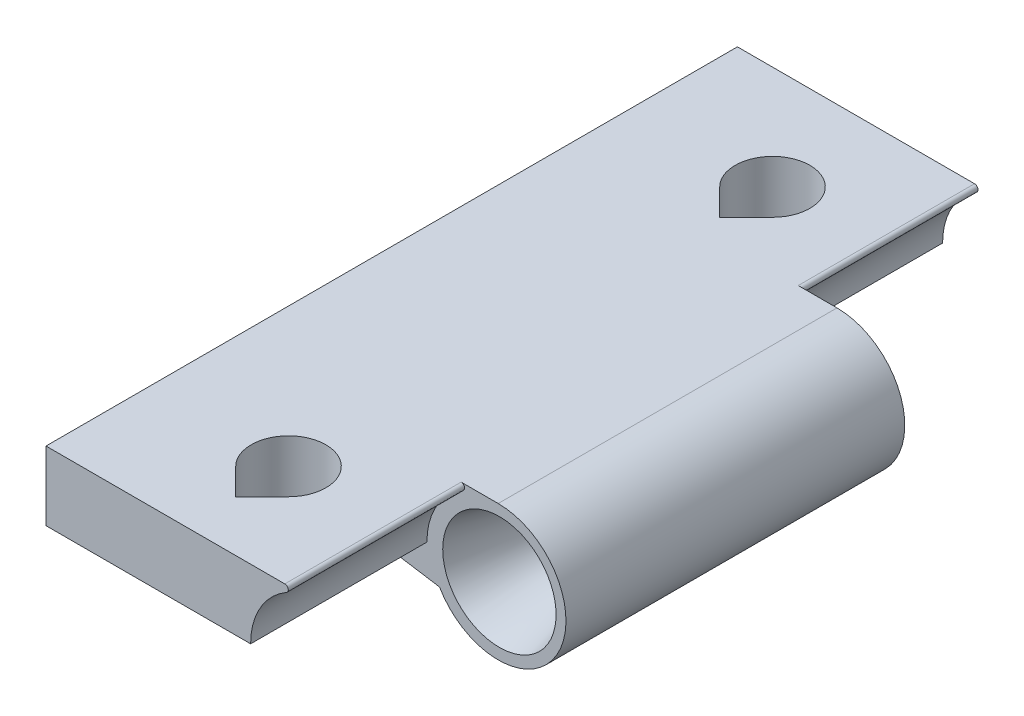
ISO-10303-21;
HEADER;
FILE_DESCRIPTION(('STEP AP214'),'2;1');
FILE_NAME('part.step','',(''),(''),'','','');
FILE_SCHEMA(('AUTOMOTIVE_DESIGN { 1 0 10303 214 1 1 1 1 }'));
ENDSEC;
DATA;
#1=APPLICATION_CONTEXT('core data for automotive mechanical design processes');
#2=APPLICATION_PROTOCOL_DEFINITION('international standard','automotive_design',2000,#1);
#3=PRODUCT_CONTEXT('',#1,'mechanical');
#4=PRODUCT('Part','Part','',(#3));
#5=PRODUCT_RELATED_PRODUCT_CATEGORY('part','',(#4));
#6=PRODUCT_DEFINITION_FORMATION('','',#4);
#7=PRODUCT_DEFINITION_CONTEXT('part definition',#1,'design');
#8=PRODUCT_DEFINITION('design','',#6,#7);
#9=PRODUCT_DEFINITION_SHAPE('','',#8);
#10=(LENGTH_UNIT() NAMED_UNIT(*) SI_UNIT(.MILLI.,.METRE.));
#11=(NAMED_UNIT(*) PLANE_ANGLE_UNIT() SI_UNIT($,.RADIAN.));
#12=(NAMED_UNIT(*) SI_UNIT($,.STERADIAN.) SOLID_ANGLE_UNIT());
#13=UNCERTAINTY_MEASURE_WITH_UNIT(LENGTH_MEASURE(1.E-05),#10,'distance_accuracy_value','');
#14=(GEOMETRIC_REPRESENTATION_CONTEXT(3) GLOBAL_UNCERTAINTY_ASSIGNED_CONTEXT((#13)) GLOBAL_UNIT_ASSIGNED_CONTEXT((#10,
#11,#12)) REPRESENTATION_CONTEXT('',''));
#15=CARTESIAN_POINT('',(0.,0.,0.));
#16=DIRECTION('',(0.,0.,1.));
#17=DIRECTION('',(1.,0.,0.));
#18=AXIS2_PLACEMENT_3D('',#15,#16,#17);
#19=CARTESIAN_POINT('',(-0.086602540378445,-0.0286580778791866,12.25));
#20=DIRECTION('',(0.,0.,-1.));
#21=DIRECTION('',(-1.,0.,0.));
#22=AXIS2_PLACEMENT_3D('',#19,#20,#21);
#23=PLANE('',#22);
#24=CARTESIAN_POINT('',(0.,0.,12.25));
#25=DIRECTION('',(0.,0.,-1.));
#26=DIRECTION('',(-1.,0.,0.));
#27=AXIS2_PLACEMENT_3D('',#24,#25,#26);
#28=CIRCLE('',#27,4.1);
#29=CARTESIAN_POINT('',(-4.1,0.,12.25));
#30=VERTEX_POINT('',#29);
#31=EDGE_CURVE('E527',#30,#30,#28,.T.);
#32=ORIENTED_EDGE('',*,*,#31,.T.);
#33=EDGE_LOOP('',(#32));
#34=FACE_BOUND('',#33,.T.);
#35=CARTESIAN_POINT('',(-2.76759308368012,4.62134192212082,12.25));
#36=DIRECTION('',(0.,0.,1.));
#37=DIRECTION('',(-1.,0.,0.));
#38=AXIS2_PLACEMENT_3D('',#35,#36,#37);
#39=CIRCLE('',#38,0.249999999999998);
#40=CARTESIAN_POINT('',(-2.64156425473294,4.40543283413654,12.25));
#41=VERTEX_POINT('',#40);
#42=CARTESIAN_POINT('',(-2.76759308368012,4.87134192212081,12.25));
#43=VERTEX_POINT('',#42);
#44=EDGE_CURVE('E205',#41,#43,#39,.T.);
#45=ORIENTED_EDGE('',*,*,#44,.F.);
#46=CARTESIAN_POINT('',(0.,-0.1200216500139,12.25));
#47=DIRECTION('',(0.,0.,-1.));
#48=DIRECTION('',(1.,0.,0.));
#49=AXIS2_PLACEMENT_3D('',#46,#47,#48);
#50=CIRCLE('',#49,5.24);
#51=CARTESIAN_POINT('',(-5.24000000000003,-0.1200216500139,12.25));
#52=VERTEX_POINT('',#51);
#53=EDGE_CURVE('E240',#52,#41,#50,.T.);
#54=ORIENTED_EDGE('',*,*,#53,.F.);
#55=DIRECTION('',(1.,0.,0.));
#56=VECTOR('',#55,1.);
#57=CARTESIAN_POINT('',(-5.24000000000002,-0.120021650013901,12.25));
#58=LINE('',#57,#56);
#59=CARTESIAN_POINT('',(-19.1498814521335,-0.120021650013903,12.25));
#60=VERTEX_POINT('',#59);
#61=EDGE_CURVE('E284',#60,#52,#58,.T.);
#62=ORIENTED_EDGE('',*,*,#61,.F.);
#63=DIRECTION('',(0.987570499863666,-0.157176677019933,0.));
#64=VECTOR('',#63,1.);
#65=CARTESIAN_POINT('',(-4.3301270189222,-2.47865807787918,12.25));
#66=LINE('',#65,#64);
#67=CARTESIAN_POINT('',(-4.3301270189222,-2.47865807787919,12.25));
#68=VERTEX_POINT('',#67);
#69=EDGE_CURVE('E224',#60,#68,#66,.T.);
#70=ORIENTED_EDGE('',*,*,#69,.T.);
#71=CARTESIAN_POINT('',(-0.086602540378445,-0.0286580778791866,12.25));
#72=DIRECTION('',(0.,0.,1.));
#73=DIRECTION('',(-1.,0.,0.));
#74=AXIS2_PLACEMENT_3D('',#71,#72,#73);
#75=CIRCLE('',#74,4.9);
#76=CARTESIAN_POINT('',(-0.086602540378445,4.87134192212081,12.25));
#77=VERTEX_POINT('',#76);
#78=EDGE_CURVE('E229',#68,#77,#75,.T.);
#79=ORIENTED_EDGE('',*,*,#78,.T.);
#80=DIRECTION('',(-1.,0.,0.));
#81=VECTOR('',#80,1.);
#82=CARTESIAN_POINT('',(-20.0380952523138,4.87134192212081,12.25));
#83=LINE('',#82,#81);
#84=EDGE_CURVE('E235',#77,#43,#83,.T.);
#85=ORIENTED_EDGE('',*,*,#84,.T.);
#86=EDGE_LOOP('',(#45,#54,#62,#70,#79,#85));
#87=FACE_BOUND('',#86,.T.);
#88=ADVANCED_FACE('F33',(#34,#87),#23,.F.);
#89=CARTESIAN_POINT('',(-2.89055194062657,4.62086573519927,-12.25));
#90=DIRECTION('',(0.,0.,-1.));
#91=DIRECTION('',(-1.,0.,0.));
#92=AXIS2_PLACEMENT_3D('',#89,#90,#91);
#93=PLANE('',#92);
#94=DIRECTION('',(0.987570499863666,-0.157176677019933,0.));
#95=VECTOR('',#94,1.);
#96=CARTESIAN_POINT('',(-4.3301270189222,-2.47865807787918,-12.25));
#97=LINE('',#96,#95);
#98=CARTESIAN_POINT('',(-20.0380952523139,0.0213419221208145,-12.25));
#99=VERTEX_POINT('',#98);
#100=CARTESIAN_POINT('',(-19.9039999584285,0.,-12.25));
#101=VERTEX_POINT('',#100);
#102=EDGE_CURVE('E257',#99,#101,#97,.T.);
#103=ORIENTED_EDGE('',*,*,#102,.F.);
#104=DIRECTION('',(0.,1.,0.));
#105=VECTOR('',#104,1.);
#106=CARTESIAN_POINT('',(-20.0380952523139,0.,-12.25));
#107=LINE('',#106,#105);
#108=CARTESIAN_POINT('',(-20.0380952523139,0.,-12.25));
#109=VERTEX_POINT('',#108);
#110=EDGE_CURVE('E272',#109,#99,#107,.T.);
#111=ORIENTED_EDGE('',*,*,#110,.F.);
#112=DIRECTION('',(-1.,0.,0.));
#113=VECTOR('',#112,1.);
#114=CARTESIAN_POINT('',(-5.2,0.,-12.25));
#115=LINE('',#114,#113);
#116=EDGE_CURVE('E298',#101,#109,#115,.T.);
#117=ORIENTED_EDGE('',*,*,#116,.F.);
#118=EDGE_LOOP('',(#103,#111,#117));
#119=FACE_BOUND('',#118,.T.);
#120=ADVANCED_FACE('F368',(#119),#93,.F.);
#121=CARTESIAN_POINT('',(-2.89055194062657,4.62086573519927,-12.25));
#122=DIRECTION('',(0.,0.,-1.));
#123=DIRECTION('',(-1.,0.,0.));
#124=AXIS2_PLACEMENT_3D('',#121,#122,#123);
#125=CYLINDRICAL_SURFACE('',#124,0.250476186921538);
#126=CARTESIAN_POINT('',(-2.89055194062656,4.62086573519927,-25.));
#127=DIRECTION('',(0.,0.,-1.));
#128=DIRECTION('',(-1.,0.,0.));
#129=AXIS2_PLACEMENT_3D('',#126,#127,#128);
#130=CIRCLE('',#129,0.250476186921538);
#131=CARTESIAN_POINT('',(-2.89055194062656,4.87134192212081,-25.));
#132=VERTEX_POINT('',#131);
#133=CARTESIAN_POINT('',(-2.75771686285407,4.40851422866369,-25.));
#134=VERTEX_POINT('',#133);
#135=EDGE_CURVE('E278',#132,#134,#130,.T.);
#136=ORIENTED_EDGE('',*,*,#135,.F.);
#137=DIRECTION('',(0.,0.,-1.));
#138=VECTOR('',#137,1.);
#139=CARTESIAN_POINT('',(-2.89055194062657,4.87134192212081,-12.25));
#140=LINE('',#139,#138);
#141=CARTESIAN_POINT('',(-2.89055194062657,4.87134192212081,-12.25));
#142=VERTEX_POINT('',#141);
#143=EDGE_CURVE('E282',#142,#132,#140,.T.);
#144=ORIENTED_EDGE('',*,*,#143,.F.);
#145=CARTESIAN_POINT('',(-2.89055194062657,4.62086573519927,-12.25));
#146=DIRECTION('',(0.,0.,-1.));
#147=DIRECTION('',(-1.,0.,0.));
#148=AXIS2_PLACEMENT_3D('',#145,#146,#147);
#149=CIRCLE('',#148,0.250476186921538);
#150=CARTESIAN_POINT('',(-2.75771686285408,4.40851422866369,-12.25));
#151=VERTEX_POINT('',#150);
#152=EDGE_CURVE('E287',#142,#151,#149,.T.);
#153=ORIENTED_EDGE('',*,*,#152,.T.);
#154=DIRECTION('',(0.,0.,-1.));
#155=VECTOR('',#154,1.);
#156=CARTESIAN_POINT('',(-2.75771686285408,4.40851422866369,-12.25));
#157=LINE('',#156,#155);
#158=EDGE_CURVE('E319',#151,#134,#157,.T.);
#159=ORIENTED_EDGE('',*,*,#158,.T.);
#160=EDGE_LOOP('',(#136,#144,#153,#159));
#161=FACE_BOUND('',#160,.T.);
#162=ADVANCED_FACE('F35',(#161),#125,.T.);
#163=CARTESIAN_POINT('',(-20.0380952523139,4.87134192212081,-12.25));
#164=DIRECTION('',(0.,1.,0.));
#165=DIRECTION('',(-1.,0.,0.));
#166=AXIS2_PLACEMENT_3D('',#163,#164,#165);
#167=PLANE('',#166);
#168=DIRECTION('',(0.707106781186543,0.,0.707106781186552));
#169=VECTOR('',#168,1.);
#170=CARTESIAN_POINT('',(-11.9091883092037,4.87134192212081,19.4091883092037));
#171=LINE('',#170,#169);
#172=CARTESIAN_POINT('',(-11.9091883092037,4.87134192212081,19.4091883092037));
#173=VERTEX_POINT('',#172);
#174=CARTESIAN_POINT('',(-10.,4.87134192212081,21.3183766184074));
#175=VERTEX_POINT('',#174);
#176=EDGE_CURVE('E48',#173,#175,#171,.T.);
#177=ORIENTED_EDGE('',*,*,#176,.F.);
#178=CARTESIAN_POINT('',(-10.,4.87134192212081,17.5));
#179=DIRECTION('',(0.,1.,0.));
#180=DIRECTION('',(0.,0.,1.));
#181=AXIS2_PLACEMENT_3D('',#178,#179,#180);
#182=CIRCLE('',#181,2.70000000000001);
#183=CARTESIAN_POINT('',(-8.09081169079631,4.87134192212081,19.4091883092037));
#184=VERTEX_POINT('',#183);
#185=EDGE_CURVE('E167',#184,#173,#182,.T.);
#186=ORIENTED_EDGE('',*,*,#185,.F.);
#187=DIRECTION('',(0.707106781186543,0.,-0.707106781186552));
#188=VECTOR('',#187,1.);
#189=CARTESIAN_POINT('',(-10.,4.87134192212081,21.3183766184074));
#190=LINE('',#189,#188);
#191=EDGE_CURVE('E174',#175,#184,#190,.T.);
#192=ORIENTED_EDGE('',*,*,#191,.F.);
#193=EDGE_LOOP('',(#177,#186,#192));
#194=FACE_BOUND('',#193,.T.);
#195=DIRECTION('',(0.707106781186544,0.,0.707106781186551));
#196=VECTOR('',#195,1.);
#197=CARTESIAN_POINT('',(-11.9091883092037,4.87134192212081,-15.5908116907963));
#198=LINE('',#197,#196);
#199=CARTESIAN_POINT('',(-11.9091883092037,4.87134192212081,-15.5908116907963));
#200=VERTEX_POINT('',#199);
#201=CARTESIAN_POINT('',(-10.,4.87134192212081,-13.6816233815926));
#202=VERTEX_POINT('',#201);
#203=EDGE_CURVE('E184',#200,#202,#198,.T.);
#204=ORIENTED_EDGE('',*,*,#203,.F.);
#205=CARTESIAN_POINT('',(-10.,4.87134192212081,-17.5));
#206=DIRECTION('',(0.,1.,0.));
#207=DIRECTION('',(0.,0.,1.));
#208=AXIS2_PLACEMENT_3D('',#205,#206,#207);
#209=CIRCLE('',#208,2.70000000000002);
#210=CARTESIAN_POINT('',(-8.09081169079631,4.87134192212081,-15.5908116907963));
#211=VERTEX_POINT('',#210);
#212=EDGE_CURVE('E190',#211,#200,#209,.T.);
#213=ORIENTED_EDGE('',*,*,#212,.F.);
#214=DIRECTION('',(0.707106781186543,0.,-0.707106781186552));
#215=VECTOR('',#214,1.);
#216=CARTESIAN_POINT('',(-10.,4.87134192212081,-13.6816233815926));
#217=LINE('',#216,#215);
#218=EDGE_CURVE('E187',#202,#211,#217,.T.);
#219=ORIENTED_EDGE('',*,*,#218,.F.);
#220=EDGE_LOOP('',(#204,#213,#219));
#221=FACE_BOUND('',#220,.T.);
#222=DIRECTION('',(1.,0.,0.));
#223=VECTOR('',#222,1.);
#224=CARTESIAN_POINT('',(-20.0380952523138,4.87134192212081,-25.));
#225=LINE('',#224,#223);
#226=CARTESIAN_POINT('',(-20.0380952523138,4.87134192212081,-25.));
#227=VERTEX_POINT('',#226);
#228=EDGE_CURVE('E291',#227,#132,#225,.T.);
#229=ORIENTED_EDGE('',*,*,#228,.F.);
#230=DIRECTION('',(0.,0.,-1.));
#231=VECTOR('',#230,1.);
#232=CARTESIAN_POINT('',(-20.0380952523139,4.87134192212081,-12.25));
#233=LINE('',#232,#231);
#234=CARTESIAN_POINT('',(-20.0380952523138,4.87134192212081,25.));
#235=VERTEX_POINT('',#234);
#236=EDGE_CURVE('E285',#235,#227,#233,.T.);
#237=ORIENTED_EDGE('',*,*,#236,.F.);
#238=DIRECTION('',(-1.,0.,0.));
#239=VECTOR('',#238,1.);
#240=CARTESIAN_POINT('',(-20.0380952523138,4.87134192212081,25.));
#241=LINE('',#240,#239);
#242=CARTESIAN_POINT('',(-2.76759308368012,4.87134192212081,25.));
#243=VERTEX_POINT('',#242);
#244=EDGE_CURVE('E211',#243,#235,#241,.T.);
#245=ORIENTED_EDGE('',*,*,#244,.F.);
#246=DIRECTION('',(0.,0.,-1.));
#247=VECTOR('',#246,1.);
#248=CARTESIAN_POINT('',(-2.76759308368012,4.87134192212081,25.));
#249=LINE('',#248,#247);
#250=EDGE_CURVE('E214',#243,#43,#249,.T.);
#251=ORIENTED_EDGE('',*,*,#250,.T.);
#252=ORIENTED_EDGE('',*,*,#84,.F.);
#253=DIRECTION('',(0.,0.,-1.));
#254=VECTOR('',#253,1.);
#255=CARTESIAN_POINT('',(-0.086602540378445,4.87134192212081,12.25));
#256=LINE('',#255,#254);
#257=CARTESIAN_POINT('',(-0.086602540378445,4.87134192212081,-12.25));
#258=VERTEX_POINT('',#257);
#259=EDGE_CURVE('E419',#77,#258,#256,.T.);
#260=ORIENTED_EDGE('',*,*,#259,.T.);
#261=DIRECTION('',(-1.,0.,0.));
#262=VECTOR('',#261,1.);
#263=CARTESIAN_POINT('',(-20.0380952523138,4.87134192212081,-12.25));
#264=LINE('',#263,#262);
#265=EDGE_CURVE('E228',#258,#142,#264,.T.);
#266=ORIENTED_EDGE('',*,*,#265,.T.);
#267=ORIENTED_EDGE('',*,*,#143,.T.);
#268=EDGE_LOOP('',(#229,#237,#245,#251,#252,#260,#266,#267));
#269=FACE_BOUND('',#268,.T.);
#270=ADVANCED_FACE('F178',(#194,#221,#269),#167,.T.);
#271=CARTESIAN_POINT('',(-20.0380952523139,0.,-12.25));
#272=DIRECTION('',(-1.,0.,0.));
#273=DIRECTION('',(0.,0.,1.));
#274=AXIS2_PLACEMENT_3D('',#271,#272,#273);
#275=PLANE('',#274);
#276=DIRECTION('',(0.,1.,0.));
#277=VECTOR('',#276,1.);
#278=CARTESIAN_POINT('',(-20.0380952523138,0.,-25.));
#279=LINE('',#278,#277);
#280=CARTESIAN_POINT('',(-20.0380952523138,0.,-25.));
#281=VERTEX_POINT('',#280);
#282=EDGE_CURVE('E310',#281,#227,#279,.T.);
#283=ORIENTED_EDGE('',*,*,#282,.F.);
#284=DIRECTION('',(0.,0.,-1.));
#285=VECTOR('',#284,1.);
#286=CARTESIAN_POINT('',(-20.0380952523139,0.,-12.25));
#287=LINE('',#286,#285);
#288=EDGE_CURVE('E316',#109,#281,#287,.T.);
#289=ORIENTED_EDGE('',*,*,#288,.F.);
#290=ORIENTED_EDGE('',*,*,#110,.T.);
#291=DIRECTION('',(0.,0.,-1.));
#292=VECTOR('',#291,1.);
#293=CARTESIAN_POINT('',(-20.0380952523138,0.0213419221208131,12.25));
#294=LINE('',#293,#292);
#295=CARTESIAN_POINT('',(-20.0380952523138,0.0213419221208131,12.25));
#296=VERTEX_POINT('',#295);
#297=EDGE_CURVE('E275',#296,#99,#294,.T.);
#298=ORIENTED_EDGE('',*,*,#297,.F.);
#299=DIRECTION('',(0.,-1.,0.));
#300=VECTOR('',#299,1.);
#301=CARTESIAN_POINT('',(-20.0380952523138,-0.120021650013904,12.25));
#302=LINE('',#301,#300);
#303=CARTESIAN_POINT('',(-20.0380952523138,-0.120021650013904,12.25));
#304=VERTEX_POINT('',#303);
#305=EDGE_CURVE('E196',#296,#304,#302,.T.);
#306=ORIENTED_EDGE('',*,*,#305,.T.);
#307=DIRECTION('',(0.,0.,-1.));
#308=VECTOR('',#307,1.);
#309=CARTESIAN_POINT('',(-20.0380952523138,-0.120021650013904,25.));
#310=LINE('',#309,#308);
#311=CARTESIAN_POINT('',(-20.0380952523138,-0.120021650013904,25.));
#312=VERTEX_POINT('',#311);
#313=EDGE_CURVE('E222',#312,#304,#310,.T.);
#314=ORIENTED_EDGE('',*,*,#313,.F.);
#315=DIRECTION('',(0.,-1.,0.));
#316=VECTOR('',#315,1.);
#317=CARTESIAN_POINT('',(-20.0380952523138,-0.120021650013904,25.));
#318=LINE('',#317,#316);
#319=EDGE_CURVE('E201',#235,#312,#318,.T.);
#320=ORIENTED_EDGE('',*,*,#319,.F.);
#321=ORIENTED_EDGE('',*,*,#236,.T.);
#322=EDGE_LOOP('',(#283,#289,#290,#298,#306,#314,#320,#321));
#323=FACE_BOUND('',#322,.T.);
#324=ADVANCED_FACE('F329',(#323),#275,.T.);
#325=CARTESIAN_POINT('',(-5.2,0.,-12.25));
#326=DIRECTION('',(0.,-1.,0.));
#327=DIRECTION('',(0.,0.,-1.));
#328=AXIS2_PLACEMENT_3D('',#325,#326,#327);
#329=PLANE('',#328);
#330=DIRECTION('',(-0.707106781186544,0.,-0.707106781186551));
#331=VECTOR('',#330,1.);
#332=CARTESIAN_POINT('',(-6.88418830920372,0.,-10.5658116907963));
#333=LINE('',#332,#331);
#334=CARTESIAN_POINT('',(-10.,0.,-13.6816233815926));
#335=VERTEX_POINT('',#334);
#336=CARTESIAN_POINT('',(-11.9091883092037,0.,-15.5908116907963));
#337=VERTEX_POINT('',#336);
#338=EDGE_CURVE('E347',#335,#337,#333,.T.);
#339=ORIENTED_EDGE('',*,*,#338,.F.);
#340=DIRECTION('',(-0.707106781186543,0.,0.707106781186552));
#341=VECTOR('',#340,1.);
#342=CARTESIAN_POINT('',(-8.31581169079633,0.,-15.3658116907963));
#343=LINE('',#342,#341);
#344=CARTESIAN_POINT('',(-8.09081169079631,0.,-15.5908116907963));
#345=VERTEX_POINT('',#344);
#346=EDGE_CURVE('E340',#345,#335,#343,.T.);
#347=ORIENTED_EDGE('',*,*,#346,.F.);
#348=CARTESIAN_POINT('',(-10.,0.,-17.5));
#349=DIRECTION('',(0.,-1.,0.));
#350=DIRECTION('',(0.,0.,-1.));
#351=AXIS2_PLACEMENT_3D('',#348,#349,#350);
#352=CIRCLE('',#351,2.70000000000002);
#353=EDGE_CURVE('E341',#337,#345,#352,.T.);
#354=ORIENTED_EDGE('',*,*,#353,.F.);
#355=EDGE_LOOP('',(#339,#347,#354));
#356=FACE_BOUND('',#355,.T.);
#357=DIRECTION('',(-1.,0.,0.));
#358=VECTOR('',#357,1.);
#359=CARTESIAN_POINT('',(-5.19999999999999,0.,-25.));
#360=LINE('',#359,#358);
#361=CARTESIAN_POINT('',(-5.19999999999999,0.,-25.));
#362=VERTEX_POINT('',#361);
#363=EDGE_CURVE('E307',#362,#281,#360,.T.);
#364=ORIENTED_EDGE('',*,*,#363,.F.);
#365=DIRECTION('',(0.,0.,-1.));
#366=VECTOR('',#365,1.);
#367=CARTESIAN_POINT('',(-5.2,0.,-12.25));
#368=LINE('',#367,#366);
#369=CARTESIAN_POINT('',(-5.2,0.,-12.25));
#370=VERTEX_POINT('',#369);
#371=EDGE_CURVE('E318',#370,#362,#368,.T.);
#372=ORIENTED_EDGE('',*,*,#371,.F.);
#373=EDGE_CURVE('E299',#370,#101,#115,.T.);
#374=ORIENTED_EDGE('',*,*,#373,.T.);
#375=ORIENTED_EDGE('',*,*,#116,.T.);
#376=ORIENTED_EDGE('',*,*,#288,.T.);
#377=EDGE_LOOP('',(#364,#372,#374,#375,#376));
#378=FACE_BOUND('',#377,.T.);
#379=ADVANCED_FACE('F399',(#356,#378),#329,.T.);
#380=CARTESIAN_POINT('',(0.,0.,-12.25));
#381=DIRECTION('',(0.,0.,-1.));
#382=DIRECTION('',(-1.,0.,0.));
#383=AXIS2_PLACEMENT_3D('',#380,#381,#382);
#384=CYLINDRICAL_SURFACE('',#383,5.2);
#385=CARTESIAN_POINT('',(0.,0.,-25.));
#386=DIRECTION('',(0.,0.,1.));
#387=DIRECTION('',(1.,0.,0.));
#388=AXIS2_PLACEMENT_3D('',#385,#386,#387);
#389=CIRCLE('',#388,5.2);
#390=EDGE_CURVE('E304',#134,#362,#389,.T.);
#391=ORIENTED_EDGE('',*,*,#390,.F.);
#392=ORIENTED_EDGE('',*,*,#158,.F.);
#393=CARTESIAN_POINT('',(0.,0.,-12.25));
#394=DIRECTION('',(0.,0.,1.));
#395=DIRECTION('',(1.,0.,0.));
#396=AXIS2_PLACEMENT_3D('',#393,#394,#395);
#397=CIRCLE('',#396,5.2);
#398=EDGE_CURVE('E290',#151,#370,#397,.T.);
#399=ORIENTED_EDGE('',*,*,#398,.T.);
#400=ORIENTED_EDGE('',*,*,#371,.T.);
#401=EDGE_LOOP('',(#391,#392,#399,#400));
#402=FACE_BOUND('',#401,.T.);
#403=ADVANCED_FACE('F393',(#402),#384,.F.);
#404=CARTESIAN_POINT('',(-2.89055194062656,4.62086573519927,-25.));
#405=DIRECTION('',(0.,0.,-1.));
#406=DIRECTION('',(-1.,0.,0.));
#407=AXIS2_PLACEMENT_3D('',#404,#405,#406);
#408=PLANE('',#407);
#409=ORIENTED_EDGE('',*,*,#135,.T.);
#410=ORIENTED_EDGE('',*,*,#390,.T.);
#411=ORIENTED_EDGE('',*,*,#363,.T.);
#412=ORIENTED_EDGE('',*,*,#282,.T.);
#413=ORIENTED_EDGE('',*,*,#228,.T.);
#414=EDGE_LOOP('',(#409,#410,#411,#412,#413));
#415=FACE_BOUND('',#414,.T.);
#416=ADVANCED_FACE('F383',(#415),#408,.T.);
#417=CARTESIAN_POINT('',(-0.086602540378445,-0.0286580778791866,-12.25));
#418=DIRECTION('',(0.,0.,-1.));
#419=DIRECTION('',(-1.,0.,0.));
#420=AXIS2_PLACEMENT_3D('',#417,#418,#419);
#421=PLANE('',#420);
#422=CARTESIAN_POINT('',(0.,0.,-12.25));
#423=DIRECTION('',(0.,0.,-1.));
#424=DIRECTION('',(-1.,0.,0.));
#425=AXIS2_PLACEMENT_3D('',#422,#423,#424);
#426=CIRCLE('',#425,4.18291636243239);
#427=CARTESIAN_POINT('',(-4.18291636243239,0.,-12.25));
#428=VERTEX_POINT('',#427);
#429=EDGE_CURVE('E530',#428,#428,#426,.T.);
#430=ORIENTED_EDGE('',*,*,#429,.F.);
#431=EDGE_LOOP('',(#430));
#432=FACE_BOUND('',#431,.T.);
#433=ORIENTED_EDGE('',*,*,#152,.F.);
#434=ORIENTED_EDGE('',*,*,#265,.F.);
#435=CARTESIAN_POINT('',(-0.086602540378445,-0.0286580778791866,-12.25));
#436=DIRECTION('',(0.,0.,1.));
#437=DIRECTION('',(-1.,0.,0.));
#438=AXIS2_PLACEMENT_3D('',#435,#436,#437);
#439=CIRCLE('',#438,4.9);
#440=CARTESIAN_POINT('',(-4.3301270189222,-2.47865807787919,-12.25));
#441=VERTEX_POINT('',#440);
#442=EDGE_CURVE('E264',#441,#258,#439,.T.);
#443=ORIENTED_EDGE('',*,*,#442,.F.);
#444=EDGE_CURVE('E253',#101,#441,#97,.T.);
#445=ORIENTED_EDGE('',*,*,#444,.F.);
#446=ORIENTED_EDGE('',*,*,#373,.F.);
#447=ORIENTED_EDGE('',*,*,#398,.F.);
#448=EDGE_LOOP('',(#433,#434,#443,#445,#446,#447));
#449=FACE_BOUND('',#448,.T.);
#450=ADVANCED_FACE('F380',(#432,#449),#421,.T.);
#451=CARTESIAN_POINT('',(-4.3301270189222,-2.47865807787918,12.25));
#452=DIRECTION('',(0.157176677019933,0.987570499863666,0.));
#453=DIRECTION('',(-0.987570499863667,0.157176677019933,0.));
#454=AXIS2_PLACEMENT_3D('',#451,#452,#453);
#455=PLANE('',#454);
#456=ORIENTED_EDGE('',*,*,#102,.T.);
#457=ORIENTED_EDGE('',*,*,#444,.T.);
#458=DIRECTION('',(0.,0.,-1.));
#459=VECTOR('',#458,1.);
#460=CARTESIAN_POINT('',(-4.3301270189222,-2.47865807787919,12.25));
#461=LINE('',#460,#459);
#462=EDGE_CURVE('E279',#68,#441,#461,.T.);
#463=ORIENTED_EDGE('',*,*,#462,.F.);
#464=ORIENTED_EDGE('',*,*,#69,.F.);
#465=EDGE_CURVE('E227',#296,#60,#66,.T.);
#466=ORIENTED_EDGE('',*,*,#465,.F.);
#467=ORIENTED_EDGE('',*,*,#297,.T.);
#468=EDGE_LOOP('',(#456,#457,#463,#464,#466,#467));
#469=FACE_BOUND('',#468,.T.);
#470=ADVANCED_FACE('F333',(#469),#455,.F.);
#471=CARTESIAN_POINT('',(-0.086602540378445,-0.0286580778791866,12.25));
#472=DIRECTION('',(0.,0.,-1.));
#473=DIRECTION('',(-1.,0.,0.));
#474=AXIS2_PLACEMENT_3D('',#471,#472,#473);
#475=CYLINDRICAL_SURFACE('',#474,4.9);
#476=ORIENTED_EDGE('',*,*,#442,.T.);
#477=ORIENTED_EDGE('',*,*,#259,.F.);
#478=ORIENTED_EDGE('',*,*,#78,.F.);
#479=ORIENTED_EDGE('',*,*,#462,.T.);
#480=EDGE_LOOP('',(#476,#477,#478,#479));
#481=FACE_BOUND('',#480,.T.);
#482=ADVANCED_FACE('F385',(#481),#475,.T.);
#483=CARTESIAN_POINT('',(-5.24000000000002,-0.120021650013901,25.));
#484=DIRECTION('',(0.,1.,0.));
#485=DIRECTION('',(-1.,0.,0.));
#486=AXIS2_PLACEMENT_3D('',#483,#484,#485);
#487=PLANE('',#486);
#488=CARTESIAN_POINT('',(-10.,-0.120021650013902,17.5));
#489=DIRECTION('',(0.,1.,0.));
#490=DIRECTION('',(-1.,0.,0.));
#491=AXIS2_PLACEMENT_3D('',#488,#489,#490);
#492=CIRCLE('',#491,2.70000000000001);
#493=CARTESIAN_POINT('',(-8.09081169079631,-0.120021650013902,19.4091883092037));
#494=VERTEX_POINT('',#493);
#495=CARTESIAN_POINT('',(-11.9091883092037,-0.120021650013903,19.4091883092037));
#496=VERTEX_POINT('',#495);
#497=EDGE_CURVE('E41',#494,#496,#492,.T.);
#498=ORIENTED_EDGE('',*,*,#497,.T.);
#499=DIRECTION('',(0.707106781186543,0.,0.707106781186552));
#500=VECTOR('',#499,1.);
#501=CARTESIAN_POINT('',(-5.77918830920374,-0.120021650013901,25.5391883092037));
#502=LINE('',#501,#500);
#503=CARTESIAN_POINT('',(-10.,-0.120021650013902,21.3183766184074));
#504=VERTEX_POINT('',#503);
#505=EDGE_CURVE('E11',#496,#504,#502,.T.);
#506=ORIENTED_EDGE('',*,*,#505,.T.);
#507=DIRECTION('',(0.707106781186543,0.,-0.707106781186552));
#508=VECTOR('',#507,1.);
#509=CARTESIAN_POINT('',(-9.46081169079634,-0.120021650013902,20.7791883092037));
#510=LINE('',#509,#508);
#511=EDGE_CURVE('E352',#504,#494,#510,.T.);
#512=ORIENTED_EDGE('',*,*,#511,.T.);
#513=EDGE_LOOP('',(#498,#506,#512));
#514=FACE_BOUND('',#513,.T.);
#515=EDGE_CURVE('E217',#304,#60,#58,.T.);
#516=ORIENTED_EDGE('',*,*,#515,.T.);
#517=ORIENTED_EDGE('',*,*,#61,.T.);
#518=DIRECTION('',(0.,0.,-1.));
#519=VECTOR('',#518,1.);
#520=CARTESIAN_POINT('',(-5.24000000000003,-0.1200216500139,25.));
#521=LINE('',#520,#519);
#522=CARTESIAN_POINT('',(-5.24000000000003,-0.1200216500139,25.));
#523=VERTEX_POINT('',#522);
#524=EDGE_CURVE('E246',#523,#52,#521,.T.);
#525=ORIENTED_EDGE('',*,*,#524,.F.);
#526=DIRECTION('',(1.,0.,0.));
#527=VECTOR('',#526,1.);
#528=CARTESIAN_POINT('',(-5.24000000000002,-0.120021650013901,25.));
#529=LINE('',#528,#527);
#530=EDGE_CURVE('E204',#312,#523,#529,.T.);
#531=ORIENTED_EDGE('',*,*,#530,.F.);
#532=ORIENTED_EDGE('',*,*,#313,.T.);
#533=EDGE_LOOP('',(#516,#517,#525,#531,#532));
#534=FACE_BOUND('',#533,.T.);
#535=ADVANCED_FACE('F339',(#514,#534),#487,.F.);
#536=CARTESIAN_POINT('',(0.,-0.1200216500139,25.));
#537=DIRECTION('',(0.,0.,-1.));
#538=DIRECTION('',(-1.,0.,0.));
#539=AXIS2_PLACEMENT_3D('',#536,#537,#538);
#540=CYLINDRICAL_SURFACE('',#539,5.24);
#541=ORIENTED_EDGE('',*,*,#53,.T.);
#542=DIRECTION('',(0.,0.,-1.));
#543=VECTOR('',#542,1.);
#544=CARTESIAN_POINT('',(-2.64156425473294,4.40543283413654,25.));
#545=LINE('',#544,#543);
#546=CARTESIAN_POINT('',(-2.64156425473294,4.40543283413654,25.));
#547=VERTEX_POINT('',#546);
#548=EDGE_CURVE('E244',#547,#41,#545,.T.);
#549=ORIENTED_EDGE('',*,*,#548,.F.);
#550=CARTESIAN_POINT('',(0.,-0.1200216500139,25.));
#551=DIRECTION('',(0.,0.,-1.));
#552=DIRECTION('',(1.,0.,0.));
#553=AXIS2_PLACEMENT_3D('',#550,#551,#552);
#554=CIRCLE('',#553,5.24);
#555=EDGE_CURVE('E207',#523,#547,#554,.T.);
#556=ORIENTED_EDGE('',*,*,#555,.F.);
#557=ORIENTED_EDGE('',*,*,#524,.T.);
#558=EDGE_LOOP('',(#541,#549,#556,#557));
#559=FACE_BOUND('',#558,.T.);
#560=ADVANCED_FACE('F434',(#559),#540,.F.);
#561=CARTESIAN_POINT('',(-2.76759308368012,4.62134192212082,25.));
#562=DIRECTION('',(0.,0.,-1.));
#563=DIRECTION('',(-1.,0.,0.));
#564=AXIS2_PLACEMENT_3D('',#561,#562,#563);
#565=CYLINDRICAL_SURFACE('',#564,0.249999999999998);
#566=ORIENTED_EDGE('',*,*,#44,.T.);
#567=ORIENTED_EDGE('',*,*,#250,.F.);
#568=CARTESIAN_POINT('',(-2.76759308368012,4.62134192212082,25.));
#569=DIRECTION('',(0.,0.,1.));
#570=DIRECTION('',(-1.,0.,0.));
#571=AXIS2_PLACEMENT_3D('',#568,#569,#570);
#572=CIRCLE('',#571,0.249999999999998);
#573=EDGE_CURVE('E209',#547,#243,#572,.T.);
#574=ORIENTED_EDGE('',*,*,#573,.F.);
#575=ORIENTED_EDGE('',*,*,#548,.T.);
#576=EDGE_LOOP('',(#566,#567,#574,#575));
#577=FACE_BOUND('',#576,.T.);
#578=ADVANCED_FACE('F431',(#577),#565,.T.);
#579=CARTESIAN_POINT('',(-2.76759308368012,4.62134192212082,25.));
#580=DIRECTION('',(0.,0.,-1.));
#581=DIRECTION('',(-1.,0.,0.));
#582=AXIS2_PLACEMENT_3D('',#579,#580,#581);
#583=PLANE('',#582);
#584=ORIENTED_EDGE('',*,*,#319,.T.);
#585=ORIENTED_EDGE('',*,*,#530,.T.);
#586=ORIENTED_EDGE('',*,*,#555,.T.);
#587=ORIENTED_EDGE('',*,*,#573,.T.);
#588=ORIENTED_EDGE('',*,*,#244,.T.);
#589=EDGE_LOOP('',(#584,#585,#586,#587,#588));
#590=FACE_BOUND('',#589,.T.);
#591=ADVANCED_FACE('F426',(#590),#583,.F.);
#592=CARTESIAN_POINT('',(-2.76759308368012,4.62134192212082,12.25));
#593=DIRECTION('',(0.,0.,-1.));
#594=DIRECTION('',(-1.,0.,0.));
#595=AXIS2_PLACEMENT_3D('',#592,#593,#594);
#596=PLANE('',#595);
#597=ORIENTED_EDGE('',*,*,#305,.F.);
#598=ORIENTED_EDGE('',*,*,#465,.T.);
#599=ORIENTED_EDGE('',*,*,#515,.F.);
#600=EDGE_LOOP('',(#597,#598,#599));
#601=FACE_BOUND('',#600,.T.);
#602=ADVANCED_FACE('F337',(#601),#596,.T.);
#603=CARTESIAN_POINT('',(-11.9091883092037,-4.92865807787919,-15.5908116907963));
#604=DIRECTION('',(-0.707106781186551,0.,0.707106781186544));
#605=DIRECTION('',(0.707106781186544,0.,0.707106781186551));
#606=AXIS2_PLACEMENT_3D('',#603,#604,#605);
#607=PLANE('',#606);
#608=ORIENTED_EDGE('',*,*,#338,.T.);
#609=DIRECTION('',(0.,1.,0.));
#610=VECTOR('',#609,1.);
#611=CARTESIAN_POINT('',(-11.9091883092037,-4.92865807787919,-15.5908116907963));
#612=LINE('',#611,#610);
#613=EDGE_CURVE('E194',#337,#200,#612,.T.);
#614=ORIENTED_EDGE('',*,*,#613,.T.);
#615=ORIENTED_EDGE('',*,*,#203,.T.);
#616=DIRECTION('',(0.,1.,0.));
#617=VECTOR('',#616,1.);
#618=CARTESIAN_POINT('',(-10.,-4.92865807787919,-13.6816233815926));
#619=LINE('',#618,#617);
#620=EDGE_CURVE('E193',#335,#202,#619,.T.);
#621=ORIENTED_EDGE('',*,*,#620,.F.);
#622=EDGE_LOOP('',(#608,#614,#615,#621));
#623=FACE_BOUND('',#622,.T.);
#624=ADVANCED_FACE('F444',(#623),#607,.F.);
#625=CARTESIAN_POINT('',(-10.,-4.92865807787919,-17.5));
#626=DIRECTION('',(0.,1.,0.));
#627=DIRECTION('',(0.,0.,1.));
#628=AXIS2_PLACEMENT_3D('',#625,#626,#627);
#629=CYLINDRICAL_SURFACE('',#628,2.70000000000002);
#630=ORIENTED_EDGE('',*,*,#353,.T.);
#631=DIRECTION('',(0.,1.,0.));
#632=VECTOR('',#631,1.);
#633=CARTESIAN_POINT('',(-8.09081169079631,-4.92865807787919,-15.5908116907963));
#634=LINE('',#633,#632);
#635=EDGE_CURVE('E197',#345,#211,#634,.T.);
#636=ORIENTED_EDGE('',*,*,#635,.T.);
#637=ORIENTED_EDGE('',*,*,#212,.T.);
#638=ORIENTED_EDGE('',*,*,#613,.F.);
#639=EDGE_LOOP('',(#630,#636,#637,#638));
#640=FACE_BOUND('',#639,.T.);
#641=ADVANCED_FACE('F363',(#640),#629,.F.);
#642=CARTESIAN_POINT('',(-10.,-4.92865807787919,-13.6816233815926));
#643=DIRECTION('',(0.707106781186552,0.,0.707106781186543));
#644=DIRECTION('',(0.707106781186543,0.,-0.707106781186552));
#645=AXIS2_PLACEMENT_3D('',#642,#643,#644);
#646=PLANE('',#645);
#647=ORIENTED_EDGE('',*,*,#346,.T.);
#648=ORIENTED_EDGE('',*,*,#620,.T.);
#649=ORIENTED_EDGE('',*,*,#218,.T.);
#650=ORIENTED_EDGE('',*,*,#635,.F.);
#651=EDGE_LOOP('',(#647,#648,#649,#650));
#652=FACE_BOUND('',#651,.T.);
#653=ADVANCED_FACE('F356',(#652),#646,.F.);
#654=CARTESIAN_POINT('',(-11.9091883092037,-4.92865807787919,19.4091883092037));
#655=DIRECTION('',(-0.707106781186552,0.,0.707106781186543));
#656=DIRECTION('',(0.707106781186543,0.,0.707106781186552));
#657=AXIS2_PLACEMENT_3D('',#654,#655,#656);
#658=PLANE('',#657);
#659=DIRECTION('',(0.,1.,0.));
#660=VECTOR('',#659,1.);
#661=CARTESIAN_POINT('',(-11.9091883092037,-4.92865807787919,19.4091883092037));
#662=LINE('',#661,#660);
#663=EDGE_CURVE('E170',#496,#173,#662,.T.);
#664=ORIENTED_EDGE('',*,*,#663,.T.);
#665=ORIENTED_EDGE('',*,*,#176,.T.);
#666=DIRECTION('',(0.,1.,0.));
#667=VECTOR('',#666,1.);
#668=CARTESIAN_POINT('',(-10.,-4.92865807787919,21.3183766184074));
#669=LINE('',#668,#667);
#670=EDGE_CURVE('E171',#504,#175,#669,.T.);
#671=ORIENTED_EDGE('',*,*,#670,.F.);
#672=ORIENTED_EDGE('',*,*,#505,.F.);
#673=EDGE_LOOP('',(#664,#665,#671,#672));
#674=FACE_BOUND('',#673,.T.);
#675=ADVANCED_FACE('F354',(#674),#658,.F.);
#676=CARTESIAN_POINT('',(-10.,-4.92865807787919,17.5));
#677=DIRECTION('',(0.,1.,0.));
#678=DIRECTION('',(0.,0.,1.));
#679=AXIS2_PLACEMENT_3D('',#676,#677,#678);
#680=CYLINDRICAL_SURFACE('',#679,2.70000000000001);
#681=DIRECTION('',(0.,1.,0.));
#682=VECTOR('',#681,1.);
#683=CARTESIAN_POINT('',(-8.09081169079631,-4.92865807787919,19.4091883092037));
#684=LINE('',#683,#682);
#685=EDGE_CURVE('E56',#494,#184,#684,.T.);
#686=ORIENTED_EDGE('',*,*,#685,.T.);
#687=ORIENTED_EDGE('',*,*,#185,.T.);
#688=ORIENTED_EDGE('',*,*,#663,.F.);
#689=ORIENTED_EDGE('',*,*,#497,.F.);
#690=EDGE_LOOP('',(#686,#687,#688,#689));
#691=FACE_BOUND('',#690,.T.);
#692=ADVANCED_FACE('F164',(#691),#680,.F.);
#693=CARTESIAN_POINT('',(-10.,-4.92865807787919,21.3183766184074));
#694=DIRECTION('',(0.707106781186552,0.,0.707106781186543));
#695=DIRECTION('',(0.707106781186543,0.,-0.707106781186552));
#696=AXIS2_PLACEMENT_3D('',#693,#694,#695);
#697=PLANE('',#696);
#698=ORIENTED_EDGE('',*,*,#670,.T.);
#699=ORIENTED_EDGE('',*,*,#191,.T.);
#700=ORIENTED_EDGE('',*,*,#685,.F.);
#701=ORIENTED_EDGE('',*,*,#511,.F.);
#702=EDGE_LOOP('',(#698,#699,#700,#701));
#703=FACE_BOUND('',#702,.T.);
#704=ADVANCED_FACE('F175',(#703),#697,.F.);
#705=CARTESIAN_POINT('',(0.,0.,0.131580953201894));
#706=DIRECTION('',(0.,0.,-1.));
#707=DIRECTION('',(-1.,0.,0.));
#708=AXIS2_PLACEMENT_3D('',#705,#706,#707);
#709=TOROIDAL_SURFACE('',#708,43.0207970580873,40.7637648387709);
#710=ORIENTED_EDGE('',*,*,#31,.F.);
#711=EDGE_LOOP('',(#710));
#712=FACE_BOUND('',#711,.T.);
#713=ORIENTED_EDGE('',*,*,#429,.T.);
#714=EDGE_LOOP('',(#713));
#715=FACE_BOUND('',#714,.T.);
#716=ADVANCED_FACE('F500',(#712,#715),#709,.T.);
#717=CLOSED_SHELL('',(#88,#120,#162,#270,#324,#379,#403,#416,#450,#470,#482,#535,#560,#578,#591,
#602,#624,#641,#653,#675,#692,#704,#716));
#718=MANIFOLD_SOLID_BREP('B2',#717);
#719=ADVANCED_BREP_SHAPE_REPRESENTATION('',(#18,#718),#14);
#720=SHAPE_DEFINITION_REPRESENTATION(#9,#719);
ENDSEC;
END-ISO-10303-21;
